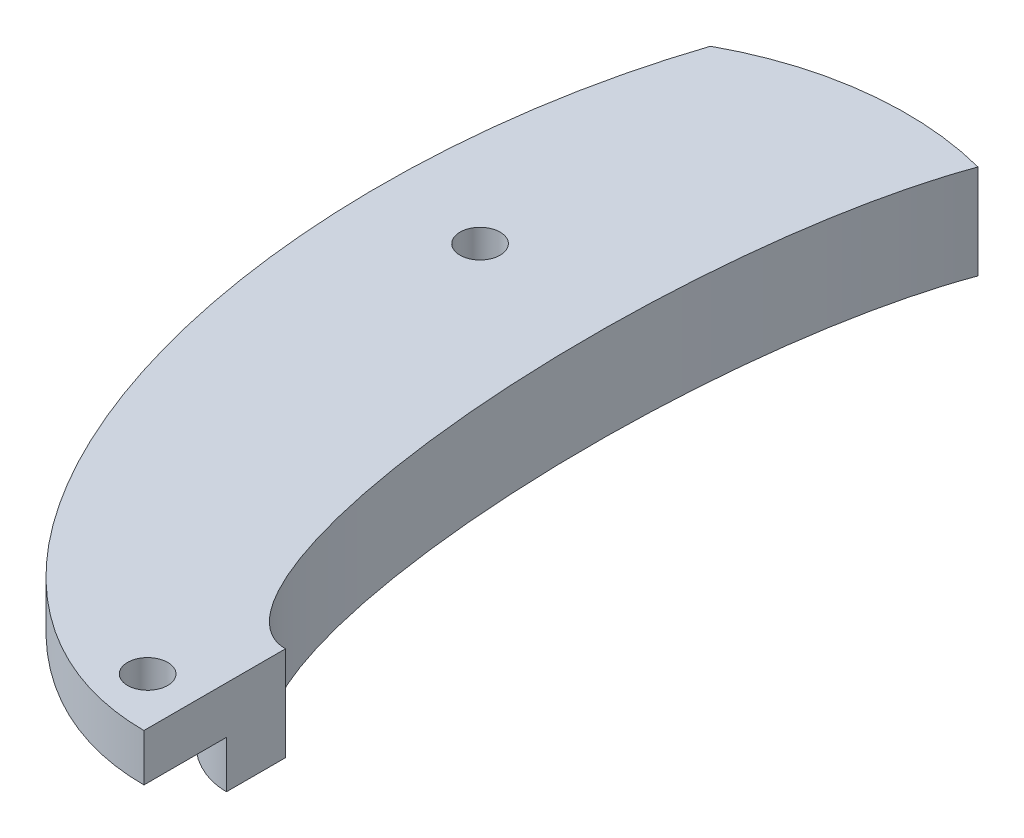
ISO-10303-21;
HEADER;
FILE_DESCRIPTION(('STEP AP214'),'2;1');
FILE_NAME('part.step','',(''),(''),'','','');
FILE_SCHEMA(('AUTOMOTIVE_DESIGN { 1 0 10303 214 1 1 1 1 }'));
ENDSEC;
DATA;
#1=APPLICATION_CONTEXT('core data for automotive mechanical design processes');
#2=APPLICATION_PROTOCOL_DEFINITION('international standard','automotive_design',2000,#1);
#3=PRODUCT_CONTEXT('',#1,'mechanical');
#4=PRODUCT('Part','Part','',(#3));
#5=PRODUCT_RELATED_PRODUCT_CATEGORY('part','',(#4));
#6=PRODUCT_DEFINITION_FORMATION('','',#4);
#7=PRODUCT_DEFINITION_CONTEXT('part definition',#1,'design');
#8=PRODUCT_DEFINITION('design','',#6,#7);
#9=PRODUCT_DEFINITION_SHAPE('','',#8);
#10=(LENGTH_UNIT() NAMED_UNIT(*) SI_UNIT(.MILLI.,.METRE.));
#11=(NAMED_UNIT(*) PLANE_ANGLE_UNIT() SI_UNIT($,.RADIAN.));
#12=(NAMED_UNIT(*) SI_UNIT($,.STERADIAN.) SOLID_ANGLE_UNIT());
#13=UNCERTAINTY_MEASURE_WITH_UNIT(LENGTH_MEASURE(1.E-05),#10,'distance_accuracy_value','');
#14=(GEOMETRIC_REPRESENTATION_CONTEXT(3) GLOBAL_UNCERTAINTY_ASSIGNED_CONTEXT((#13)) GLOBAL_UNIT_ASSIGNED_CONTEXT((#10,
#11,#12)) REPRESENTATION_CONTEXT('',''));
#15=CARTESIAN_POINT('',(0.,0.,0.));
#16=DIRECTION('',(0.,0.,1.));
#17=DIRECTION('',(1.,0.,0.));
#18=AXIS2_PLACEMENT_3D('',#15,#16,#17);
#19=CARTESIAN_POINT('',(0.,4.,0.));
#20=DIRECTION('',(0.,1.,0.));
#21=DIRECTION('',(0.,0.,1.));
#22=AXIS2_PLACEMENT_3D('',#19,#20,#21);
#23=PLANE('',#22);
#24=DIRECTION('',(0.,0.,-1.));
#25=VECTOR('',#24,1.);
#26=CARTESIAN_POINT('',(0.,4.,50.));
#27=LINE('',#26,#25);
#28=CARTESIAN_POINT('',(0.,4.,50.));
#29=VERTEX_POINT('',#28);
#30=CARTESIAN_POINT('',(0.,4.,38.));
#31=VERTEX_POINT('',#30);
#32=EDGE_CURVE('E169',#29,#31,#27,.T.);
#33=ORIENTED_EDGE('',*,*,#32,.T.);
#34=CARTESIAN_POINT('',(0.,4.,2.));
#35=DIRECTION('',(0.,-1.,0.));
#36=DIRECTION('',(0.,0.,1.));
#37=AXIS2_PLACEMENT_3D('',#34,#35,#36);
#38=ELLIPSE('',#37,36.,10.);
#39=CARTESIAN_POINT('',(-6.0211122247969,4.,-26.742839981292));
#40=VERTEX_POINT('',#39);
#41=EDGE_CURVE('E117',#31,#40,#38,.T.);
#42=ORIENTED_EDGE('',*,*,#41,.T.);
#43=CARTESIAN_POINT('',(-13.,4.,4.50401092710764E-13));
#44=DIRECTION('',(0.,1.,0.));
#45=DIRECTION('',(0.,0.,1.));
#46=AXIS2_PLACEMENT_3D('',#43,#44,#45);
#47=CIRCLE('',#46,27.6384580764538);
#48=CARTESIAN_POINT('',(-26.2300133379316,4.,-24.2662545919642));
#49=VERTEX_POINT('',#48);
#50=EDGE_CURVE('E57',#40,#49,#47,.T.);
#51=ORIENTED_EDGE('',*,*,#50,.T.);
#52=CARTESIAN_POINT('',(0.,4.,0.));
#53=DIRECTION('',(0.,1.,0.));
#54=DIRECTION('',(0.,0.,1.));
#55=AXIS2_PLACEMENT_3D('',#52,#53,#54);
#56=ELLIPSE('',#55,50.,30.);
#57=EDGE_CURVE('E168',#49,#29,#56,.T.);
#58=ORIENTED_EDGE('',*,*,#57,.T.);
#59=EDGE_LOOP('',(#33,#42,#51,#58));
#60=FACE_BOUND('',#59,.T.);
#61=CARTESIAN_POINT('',(-3.99729247475969,4.,45.6892620559413));
#62=DIRECTION('',(0.,1.,0.));
#63=DIRECTION('',(0.,0.,1.));
#64=AXIS2_PLACEMENT_3D('',#61,#62,#63);
#65=CIRCLE('',#64,1.7);
#66=CARTESIAN_POINT('',(-3.99729247475969,4.,47.3892620559413));
#67=VERTEX_POINT('',#66);
#68=EDGE_CURVE('E158',#67,#67,#65,.T.);
#69=ORIENTED_EDGE('',*,*,#68,.F.);
#70=EDGE_LOOP('',(#69));
#71=FACE_BOUND('',#70,.T.);
#72=CARTESIAN_POINT('',(-21.5,4.,4.81824424760352E-13));
#73=DIRECTION('',(0.,1.,0.));
#74=DIRECTION('',(0.,0.,1.));
#75=AXIS2_PLACEMENT_3D('',#72,#73,#74);
#76=CIRCLE('',#75,1.7);
#77=CARTESIAN_POINT('',(-21.5,4.,1.70000000000048));
#78=VERTEX_POINT('',#77);
#79=EDGE_CURVE('E173',#78,#78,#76,.T.);
#80=ORIENTED_EDGE('',*,*,#79,.F.);
#81=EDGE_LOOP('',(#80));
#82=FACE_BOUND('',#81,.T.);
#83=ADVANCED_FACE('F37',(#60,#71,#82),#23,.T.);
#84=CARTESIAN_POINT('',(0.,0.,0.));
#85=DIRECTION('',(0.,1.,0.));
#86=DIRECTION('',(0.,0.,1.));
#87=AXIS2_PLACEMENT_3D('',#84,#85,#86);
#88=PLANE('',#87);
#89=CARTESIAN_POINT('',(-13.,0.,4.50401092710764E-13));
#90=DIRECTION('',(0.,1.,0.));
#91=DIRECTION('',(0.,0.,1.));
#92=AXIS2_PLACEMENT_3D('',#89,#90,#91);
#93=CIRCLE('',#92,27.6384580764538);
#94=CARTESIAN_POINT('',(-10.4107837813911,0.,-27.5169097868414));
#95=VERTEX_POINT('',#94);
#96=CARTESIAN_POINT('',(-26.2300133379316,0.,-24.2662545919642));
#97=VERTEX_POINT('',#96);
#98=EDGE_CURVE('E160',#95,#97,#93,.T.);
#99=ORIENTED_EDGE('',*,*,#98,.F.);
#100=CARTESIAN_POINT('',(0.,0.,2.));
#101=DIRECTION('',(0.,1.,0.));
#102=DIRECTION('',(0.,0.,1.));
#103=AXIS2_PLACEMENT_3D('',#100,#101,#102);
#104=ELLIPSE('',#103,41.,15.);
#105=CARTESIAN_POINT('',(0.,0.,43.));
#106=VERTEX_POINT('',#105);
#107=EDGE_CURVE('E178',#95,#106,#104,.T.);
#108=ORIENTED_EDGE('',*,*,#107,.T.);
#109=DIRECTION('',(0.,0.,-1.));
#110=VECTOR('',#109,1.);
#111=CARTESIAN_POINT('',(0.,0.,50.));
#112=LINE('',#111,#110);
#113=CARTESIAN_POINT('',(0.,0.,50.));
#114=VERTEX_POINT('',#113);
#115=EDGE_CURVE('E69',#114,#106,#112,.T.);
#116=ORIENTED_EDGE('',*,*,#115,.F.);
#117=CARTESIAN_POINT('',(0.,0.,0.));
#118=DIRECTION('',(0.,1.,0.));
#119=DIRECTION('',(0.,0.,1.));
#120=AXIS2_PLACEMENT_3D('',#117,#118,#119);
#121=ELLIPSE('',#120,50.,30.);
#122=EDGE_CURVE('E155',#97,#114,#121,.T.);
#123=ORIENTED_EDGE('',*,*,#122,.F.);
#124=EDGE_LOOP('',(#99,#108,#116,#123));
#125=FACE_BOUND('',#124,.T.);
#126=CARTESIAN_POINT('',(-3.99729247475969,0.,45.6892620559413));
#127=DIRECTION('',(0.,1.,0.));
#128=DIRECTION('',(0.,0.,1.));
#129=AXIS2_PLACEMENT_3D('',#126,#127,#128);
#130=CIRCLE('',#129,1.7);
#131=CARTESIAN_POINT('',(-3.99729247475969,0.,47.3892620559413));
#132=VERTEX_POINT('',#131);
#133=EDGE_CURVE('E162',#132,#132,#130,.T.);
#134=ORIENTED_EDGE('',*,*,#133,.T.);
#135=EDGE_LOOP('',(#134));
#136=FACE_BOUND('',#135,.T.);
#137=CARTESIAN_POINT('',(-21.5,0.,4.81824424760352E-13));
#138=DIRECTION('',(0.,1.,0.));
#139=DIRECTION('',(0.,0.,1.));
#140=AXIS2_PLACEMENT_3D('',#137,#138,#139);
#141=CIRCLE('',#140,1.7);
#142=CARTESIAN_POINT('',(-21.5,0.,1.70000000000048));
#143=VERTEX_POINT('',#142);
#144=EDGE_CURVE('E175',#143,#143,#141,.T.);
#145=ORIENTED_EDGE('',*,*,#144,.T.);
#146=EDGE_LOOP('',(#145));
#147=FACE_BOUND('',#146,.T.);
#148=ADVANCED_FACE('F139',(#125,#136,#147),#88,.F.);
#149=DIRECTION('',(0.,-1.,0.));
#150=VECTOR('',#149,1.);
#151=SURFACE_OF_LINEAR_EXTRUSION('',#56,#150);
#152=ORIENTED_EDGE('',*,*,#122,.T.);
#153=DIRECTION('',(0.,-1.,0.));
#154=VECTOR('',#153,1.);
#155=CARTESIAN_POINT('',(0.,4.,50.));
#156=LINE('',#155,#154);
#157=EDGE_CURVE('E11',#29,#114,#156,.T.);
#158=ORIENTED_EDGE('',*,*,#157,.F.);
#159=ORIENTED_EDGE('',*,*,#57,.F.);
#160=DIRECTION('',(0.,-1.,0.));
#161=VECTOR('',#160,1.);
#162=CARTESIAN_POINT('',(-26.2300133379316,4.,-24.2662545919642));
#163=LINE('',#162,#161);
#164=EDGE_CURVE('E48',#49,#97,#163,.T.);
#165=ORIENTED_EDGE('',*,*,#164,.T.);
#166=EDGE_LOOP('',(#152,#158,#159,#165));
#167=FACE_BOUND('',#166,.T.);
#168=ADVANCED_FACE('F39',(#167),#151,.F.);
#169=CARTESIAN_POINT('',(0.,4.,50.));
#170=DIRECTION('',(-1.,0.,0.));
#171=DIRECTION('',(0.,0.,1.));
#172=AXIS2_PLACEMENT_3D('',#169,#170,#171);
#173=PLANE('',#172);
#174=ORIENTED_EDGE('',*,*,#115,.T.);
#175=DIRECTION('',(0.,1.,0.));
#176=VECTOR('',#175,1.);
#177=CARTESIAN_POINT('',(0.,-4.,43.));
#178=LINE('',#177,#176);
#179=CARTESIAN_POINT('',(0.,-4.,43.));
#180=VERTEX_POINT('',#179);
#181=EDGE_CURVE('E77',#180,#106,#178,.T.);
#182=ORIENTED_EDGE('',*,*,#181,.F.);
#183=DIRECTION('',(0.,0.,-1.));
#184=VECTOR('',#183,1.);
#185=CARTESIAN_POINT('',(0.,-4.,43.));
#186=LINE('',#185,#184);
#187=CARTESIAN_POINT('',(0.,-4.,38.));
#188=VERTEX_POINT('',#187);
#189=EDGE_CURVE('E100',#180,#188,#186,.T.);
#190=ORIENTED_EDGE('',*,*,#189,.T.);
#191=DIRECTION('',(0.,1.,0.));
#192=VECTOR('',#191,1.);
#193=CARTESIAN_POINT('',(0.,-4.,38.));
#194=LINE('',#193,#192);
#195=EDGE_CURVE('E101',#188,#31,#194,.T.);
#196=ORIENTED_EDGE('',*,*,#195,.T.);
#197=ORIENTED_EDGE('',*,*,#32,.F.);
#198=ORIENTED_EDGE('',*,*,#157,.T.);
#199=EDGE_LOOP('',(#174,#182,#190,#196,#197,#198));
#200=FACE_BOUND('',#199,.T.);
#201=ADVANCED_FACE('F98',(#200),#173,.F.);
#202=CARTESIAN_POINT('',(-13.,4.,4.50401092710764E-13));
#203=DIRECTION('',(0.,-1.,0.));
#204=DIRECTION('',(0.,0.,-1.));
#205=AXIS2_PLACEMENT_3D('',#202,#203,#204);
#206=CYLINDRICAL_SURFACE('',#205,27.6384580764538);
#207=DIRECTION('',(0.,1.,0.));
#208=VECTOR('',#207,1.);
#209=CARTESIAN_POINT('',(-10.4107837813911,-4.,-27.5169097868414));
#210=LINE('',#209,#208);
#211=CARTESIAN_POINT('',(-10.4107837813911,-4.,-27.5169097868414));
#212=VERTEX_POINT('',#211);
#213=EDGE_CURVE('E116',#212,#95,#210,.T.);
#214=ORIENTED_EDGE('',*,*,#213,.T.);
#215=ORIENTED_EDGE('',*,*,#98,.T.);
#216=ORIENTED_EDGE('',*,*,#164,.F.);
#217=ORIENTED_EDGE('',*,*,#50,.F.);
#218=DIRECTION('',(0.,1.,0.));
#219=VECTOR('',#218,1.);
#220=CARTESIAN_POINT('',(-6.0211122247969,-4.,-26.742839981292));
#221=LINE('',#220,#219);
#222=CARTESIAN_POINT('',(-6.0211122247969,-4.,-26.742839981292));
#223=VERTEX_POINT('',#222);
#224=EDGE_CURVE('E187',#223,#40,#221,.T.);
#225=ORIENTED_EDGE('',*,*,#224,.F.);
#226=CARTESIAN_POINT('',(-13.,-4.,4.50401092710764E-13));
#227=DIRECTION('',(0.,1.,0.));
#228=DIRECTION('',(0.,0.,-1.));
#229=AXIS2_PLACEMENT_3D('',#226,#227,#228);
#230=CIRCLE('',#229,27.6384580764539);
#231=EDGE_CURVE('E102',#223,#212,#230,.T.);
#232=ORIENTED_EDGE('',*,*,#231,.T.);
#233=EDGE_LOOP('',(#214,#215,#216,#217,#225,#232));
#234=FACE_BOUND('',#233,.T.);
#235=ADVANCED_FACE('F135',(#234),#206,.T.);
#236=CARTESIAN_POINT('',(-3.99729247475969,4.,45.6892620559413));
#237=DIRECTION('',(0.,-1.,0.));
#238=DIRECTION('',(0.,0.,-1.));
#239=AXIS2_PLACEMENT_3D('',#236,#237,#238);
#240=CYLINDRICAL_SURFACE('',#239,1.7);
#241=ORIENTED_EDGE('',*,*,#68,.T.);
#242=EDGE_LOOP('',(#241));
#243=FACE_BOUND('',#242,.T.);
#244=ORIENTED_EDGE('',*,*,#133,.F.);
#245=EDGE_LOOP('',(#244));
#246=FACE_BOUND('',#245,.T.);
#247=ADVANCED_FACE('F131',(#243,#246),#240,.F.);
#248=CARTESIAN_POINT('',(-21.5,4.,4.81824424760352E-13));
#249=DIRECTION('',(0.,-1.,0.));
#250=DIRECTION('',(0.,0.,-1.));
#251=AXIS2_PLACEMENT_3D('',#248,#249,#250);
#252=CYLINDRICAL_SURFACE('',#251,1.7);
#253=ORIENTED_EDGE('',*,*,#79,.T.);
#254=EDGE_LOOP('',(#253));
#255=FACE_BOUND('',#254,.T.);
#256=ORIENTED_EDGE('',*,*,#144,.F.);
#257=EDGE_LOOP('',(#256));
#258=FACE_BOUND('',#257,.T.);
#259=ADVANCED_FACE('F127',(#255,#258),#252,.F.);
#260=CARTESIAN_POINT('',(0.,-4.,2.));
#261=DIRECTION('',(0.,1.,0.));
#262=DIRECTION('',(0.,0.,1.));
#263=AXIS2_PLACEMENT_3D('',#260,#261,#262);
#264=ELLIPSE('',#263,41.,15.);
#265=DIRECTION('',(0.,1.,0.));
#266=VECTOR('',#265,1.);
#267=SURFACE_OF_LINEAR_EXTRUSION('',#264,#266);
#268=ORIENTED_EDGE('',*,*,#107,.F.);
#269=ORIENTED_EDGE('',*,*,#213,.F.);
#270=EDGE_CURVE('E109',#212,#180,#264,.T.);
#271=ORIENTED_EDGE('',*,*,#270,.T.);
#272=ORIENTED_EDGE('',*,*,#181,.T.);
#273=EDGE_LOOP('',(#268,#269,#271,#272));
#274=FACE_BOUND('',#273,.T.);
#275=ADVANCED_FACE('F114',(#274),#267,.T.);
#276=CARTESIAN_POINT('',(0.,-4.,2.));
#277=DIRECTION('',(0.,-1.,0.));
#278=DIRECTION('',(0.,0.,1.));
#279=AXIS2_PLACEMENT_3D('',#276,#277,#278);
#280=ELLIPSE('',#279,36.,10.);
#281=DIRECTION('',(0.,1.,0.));
#282=VECTOR('',#281,1.);
#283=SURFACE_OF_LINEAR_EXTRUSION('',#280,#282);
#284=ORIENTED_EDGE('',*,*,#41,.F.);
#285=ORIENTED_EDGE('',*,*,#195,.F.);
#286=EDGE_CURVE('E112',#188,#223,#280,.T.);
#287=ORIENTED_EDGE('',*,*,#286,.T.);
#288=ORIENTED_EDGE('',*,*,#224,.T.);
#289=EDGE_LOOP('',(#284,#285,#287,#288));
#290=FACE_BOUND('',#289,.T.);
#291=ADVANCED_FACE('F126',(#290),#283,.T.);
#292=CARTESIAN_POINT('',(0.,-4.,2.));
#293=DIRECTION('',(0.,1.,0.));
#294=DIRECTION('',(0.,0.,1.));
#295=AXIS2_PLACEMENT_3D('',#292,#293,#294);
#296=PLANE('',#295);
#297=ORIENTED_EDGE('',*,*,#270,.F.);
#298=ORIENTED_EDGE('',*,*,#231,.F.);
#299=ORIENTED_EDGE('',*,*,#286,.F.);
#300=ORIENTED_EDGE('',*,*,#189,.F.);
#301=EDGE_LOOP('',(#297,#298,#299,#300));
#302=FACE_BOUND('',#301,.T.);
#303=ADVANCED_FACE('F107',(#302),#296,.F.);
#304=CLOSED_SHELL('',(#83,#148,#168,#201,#235,#247,#259,#275,#291,#303));
#305=MANIFOLD_SOLID_BREP('B2',#304);
#306=ADVANCED_BREP_SHAPE_REPRESENTATION('',(#18,#305),#14);
#307=SHAPE_DEFINITION_REPRESENTATION(#9,#306);
ENDSEC;
END-ISO-10303-21;
